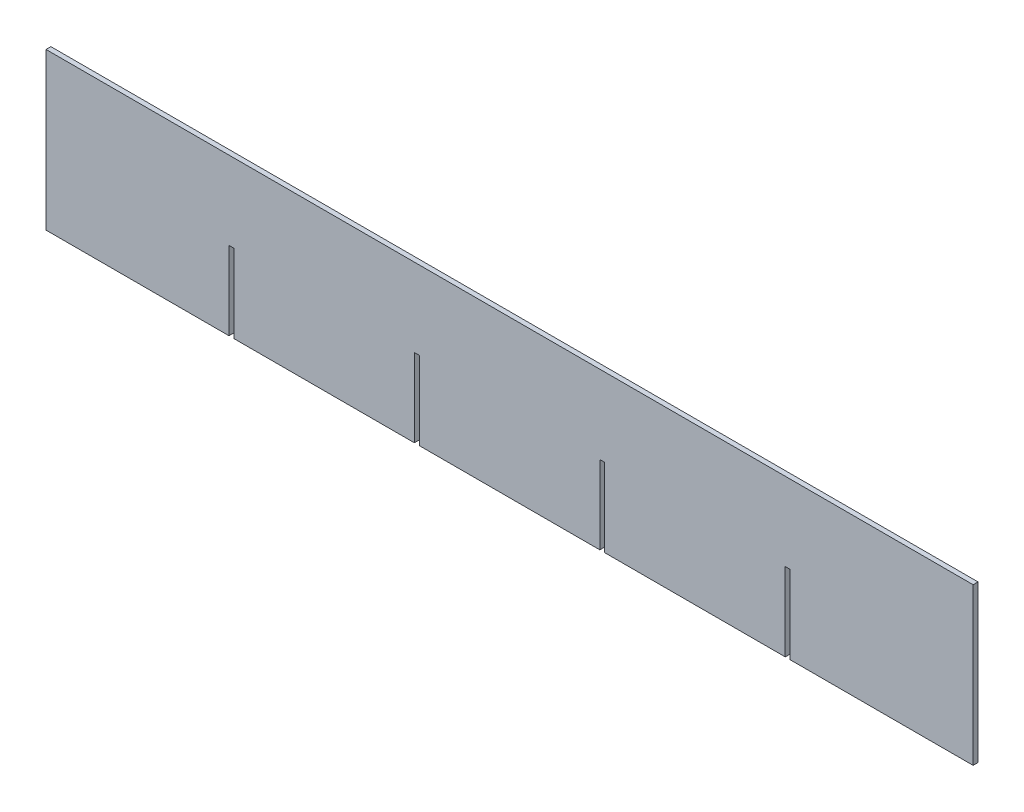
ISO-10303-21;
HEADER;
FILE_DESCRIPTION(('STEP AP214'),'2;1');
FILE_NAME('part.step','',(''),(''),'','','');
FILE_SCHEMA(('AUTOMOTIVE_DESIGN { 1 0 10303 214 1 1 1 1 }'));
ENDSEC;
DATA;
#1=APPLICATION_CONTEXT('core data for automotive mechanical design processes');
#2=APPLICATION_PROTOCOL_DEFINITION('international standard','automotive_design',2000,#1);
#3=PRODUCT_CONTEXT('',#1,'mechanical');
#4=PRODUCT('Part','Part','',(#3));
#5=PRODUCT_RELATED_PRODUCT_CATEGORY('part','',(#4));
#6=PRODUCT_DEFINITION_FORMATION('','',#4);
#7=PRODUCT_DEFINITION_CONTEXT('part definition',#1,'design');
#8=PRODUCT_DEFINITION('design','',#6,#7);
#9=PRODUCT_DEFINITION_SHAPE('','',#8);
#10=(LENGTH_UNIT() NAMED_UNIT(*) SI_UNIT(.MILLI.,.METRE.));
#11=(NAMED_UNIT(*) PLANE_ANGLE_UNIT() SI_UNIT($,.RADIAN.));
#12=(NAMED_UNIT(*) SI_UNIT($,.STERADIAN.) SOLID_ANGLE_UNIT());
#13=UNCERTAINTY_MEASURE_WITH_UNIT(LENGTH_MEASURE(1.E-05),#10,'distance_accuracy_value','');
#14=(GEOMETRIC_REPRESENTATION_CONTEXT(3) GLOBAL_UNCERTAINTY_ASSIGNED_CONTEXT((#13)) GLOBAL_UNIT_ASSIGNED_CONTEXT((#10,
#11,#12)) REPRESENTATION_CONTEXT('',''));
#15=CARTESIAN_POINT('',(0.,0.,0.));
#16=DIRECTION('',(0.,0.,1.));
#17=DIRECTION('',(1.,0.,0.));
#18=AXIS2_PLACEMENT_3D('',#15,#16,#17);
#19=CARTESIAN_POINT('',(237.,40.,1.25));
#20=DIRECTION('',(-1.,0.,0.));
#21=DIRECTION('',(0.,0.,1.));
#22=AXIS2_PLACEMENT_3D('',#19,#20,#21);
#23=PLANE('',#22);
#24=DIRECTION('',(0.,1.,0.));
#25=VECTOR('',#24,1.);
#26=CARTESIAN_POINT('',(237.,40.,-1.25));
#27=LINE('',#26,#25);
#28=CARTESIAN_POINT('',(237.,-40.,-1.25));
#29=VERTEX_POINT('',#28);
#30=CARTESIAN_POINT('',(237.,40.,-1.25));
#31=VERTEX_POINT('',#30);
#32=EDGE_CURVE('E207',#29,#31,#27,.T.);
#33=ORIENTED_EDGE('',*,*,#32,.T.);
#34=DIRECTION('',(0.,0.,-1.));
#35=VECTOR('',#34,1.);
#36=CARTESIAN_POINT('',(237.,40.,1.25));
#37=LINE('',#36,#35);
#38=CARTESIAN_POINT('',(237.,40.,1.25));
#39=VERTEX_POINT('',#38);
#40=EDGE_CURVE('E11',#39,#31,#37,.T.);
#41=ORIENTED_EDGE('',*,*,#40,.F.);
#42=DIRECTION('',(0.,1.,0.));
#43=VECTOR('',#42,1.);
#44=CARTESIAN_POINT('',(237.,40.,1.25));
#45=LINE('',#44,#43);
#46=CARTESIAN_POINT('',(237.,-40.,1.25));
#47=VERTEX_POINT('',#46);
#48=EDGE_CURVE('E245',#47,#39,#45,.T.);
#49=ORIENTED_EDGE('',*,*,#48,.F.);
#50=DIRECTION('',(0.,0.,-1.));
#51=VECTOR('',#50,1.);
#52=CARTESIAN_POINT('',(237.,-40.,1.25));
#53=LINE('',#52,#51);
#54=EDGE_CURVE('E203',#47,#29,#53,.T.);
#55=ORIENTED_EDGE('',*,*,#54,.T.);
#56=EDGE_LOOP('',(#33,#41,#49,#55));
#57=FACE_BOUND('',#56,.T.);
#58=ADVANCED_FACE('F39',(#57),#23,.F.);
#59=CARTESIAN_POINT('',(-237.,40.,1.25));
#60=DIRECTION('',(0.,-1.,0.));
#61=DIRECTION('',(0.,0.,-1.));
#62=AXIS2_PLACEMENT_3D('',#59,#60,#61);
#63=PLANE('',#62);
#64=DIRECTION('',(-1.,0.,0.));
#65=VECTOR('',#64,1.);
#66=CARTESIAN_POINT('',(-237.,40.,-1.25));
#67=LINE('',#66,#65);
#68=CARTESIAN_POINT('',(-237.,40.,-1.25));
#69=VERTEX_POINT('',#68);
#70=EDGE_CURVE('E210',#31,#69,#67,.T.);
#71=ORIENTED_EDGE('',*,*,#70,.T.);
#72=DIRECTION('',(0.,0.,-1.));
#73=VECTOR('',#72,1.);
#74=CARTESIAN_POINT('',(-237.,40.,1.25));
#75=LINE('',#74,#73);
#76=CARTESIAN_POINT('',(-237.,40.,1.25));
#77=VERTEX_POINT('',#76);
#78=EDGE_CURVE('E47',#77,#69,#75,.T.);
#79=ORIENTED_EDGE('',*,*,#78,.F.);
#80=DIRECTION('',(-1.,0.,0.));
#81=VECTOR('',#80,1.);
#82=CARTESIAN_POINT('',(-237.,40.,1.25));
#83=LINE('',#82,#81);
#84=EDGE_CURVE('E134',#39,#77,#83,.T.);
#85=ORIENTED_EDGE('',*,*,#84,.F.);
#86=ORIENTED_EDGE('',*,*,#40,.T.);
#87=EDGE_LOOP('',(#71,#79,#85,#86));
#88=FACE_BOUND('',#87,.T.);
#89=ADVANCED_FACE('F363',(#88),#63,.F.);
#90=CARTESIAN_POINT('',(-237.,-40.,1.25));
#91=DIRECTION('',(1.,0.,0.));
#92=DIRECTION('',(0.,0.,-1.));
#93=AXIS2_PLACEMENT_3D('',#90,#91,#92);
#94=PLANE('',#93);
#95=DIRECTION('',(0.,-1.,0.));
#96=VECTOR('',#95,1.);
#97=CARTESIAN_POINT('',(-237.,-40.,-1.25));
#98=LINE('',#97,#96);
#99=CARTESIAN_POINT('',(-237.,-40.,-1.25));
#100=VERTEX_POINT('',#99);
#101=EDGE_CURVE('E212',#69,#100,#98,.T.);
#102=ORIENTED_EDGE('',*,*,#101,.T.);
#103=DIRECTION('',(0.,0.,-1.));
#104=VECTOR('',#103,1.);
#105=CARTESIAN_POINT('',(-237.,-40.,1.25));
#106=LINE('',#105,#104);
#107=CARTESIAN_POINT('',(-237.,-40.,1.25));
#108=VERTEX_POINT('',#107);
#109=EDGE_CURVE('E288',#108,#100,#106,.T.);
#110=ORIENTED_EDGE('',*,*,#109,.F.);
#111=DIRECTION('',(0.,-1.,0.));
#112=VECTOR('',#111,1.);
#113=CARTESIAN_POINT('',(-237.,-40.,1.25));
#114=LINE('',#113,#112);
#115=EDGE_CURVE('E296',#77,#108,#114,.T.);
#116=ORIENTED_EDGE('',*,*,#115,.F.);
#117=ORIENTED_EDGE('',*,*,#78,.T.);
#118=EDGE_LOOP('',(#102,#110,#116,#117));
#119=FACE_BOUND('',#118,.T.);
#120=ADVANCED_FACE('F294',(#119),#94,.F.);
#121=CARTESIAN_POINT('',(-143.45,-40.,1.25));
#122=DIRECTION('',(0.,1.,0.));
#123=DIRECTION('',(0.,0.,1.));
#124=AXIS2_PLACEMENT_3D('',#121,#122,#123);
#125=PLANE('',#124);
#126=DIRECTION('',(1.,0.,0.));
#127=VECTOR('',#126,1.);
#128=CARTESIAN_POINT('',(-143.45,-40.,-1.25));
#129=LINE('',#128,#127);
#130=CARTESIAN_POINT('',(-143.45,-40.,-1.25));
#131=VERTEX_POINT('',#130);
#132=EDGE_CURVE('E214',#100,#131,#129,.T.);
#133=ORIENTED_EDGE('',*,*,#132,.T.);
#134=DIRECTION('',(0.,0.,-1.));
#135=VECTOR('',#134,1.);
#136=CARTESIAN_POINT('',(-143.45,-40.,1.25));
#137=LINE('',#136,#135);
#138=CARTESIAN_POINT('',(-143.45,-40.,1.25));
#139=VERTEX_POINT('',#138);
#140=EDGE_CURVE('E285',#139,#131,#137,.T.);
#141=ORIENTED_EDGE('',*,*,#140,.F.);
#142=DIRECTION('',(1.,0.,0.));
#143=VECTOR('',#142,1.);
#144=CARTESIAN_POINT('',(-143.45,-40.,1.25));
#145=LINE('',#144,#143);
#146=EDGE_CURVE('E314',#108,#139,#145,.T.);
#147=ORIENTED_EDGE('',*,*,#146,.F.);
#148=ORIENTED_EDGE('',*,*,#109,.T.);
#149=EDGE_LOOP('',(#133,#141,#147,#148));
#150=FACE_BOUND('',#149,.T.);
#151=ADVANCED_FACE('F305',(#150),#125,.F.);
#152=CARTESIAN_POINT('',(-143.45,-40.,1.25));
#153=DIRECTION('',(-1.,0.,0.));
#154=DIRECTION('',(0.,0.,1.));
#155=AXIS2_PLACEMENT_3D('',#152,#153,#154);
#156=PLANE('',#155);
#157=DIRECTION('',(0.,1.,0.));
#158=VECTOR('',#157,1.);
#159=CARTESIAN_POINT('',(-143.45,-40.,-1.25));
#160=LINE('',#159,#158);
#161=CARTESIAN_POINT('',(-143.45,0.,-1.25));
#162=VERTEX_POINT('',#161);
#163=EDGE_CURVE('E216',#131,#162,#160,.T.);
#164=ORIENTED_EDGE('',*,*,#163,.T.);
#165=DIRECTION('',(0.,0.,-1.));
#166=VECTOR('',#165,1.);
#167=CARTESIAN_POINT('',(-143.45,0.,1.25));
#168=LINE('',#167,#166);
#169=CARTESIAN_POINT('',(-143.45,0.,1.25));
#170=VERTEX_POINT('',#169);
#171=EDGE_CURVE('E282',#170,#162,#168,.T.);
#172=ORIENTED_EDGE('',*,*,#171,.F.);
#173=DIRECTION('',(0.,1.,0.));
#174=VECTOR('',#173,1.);
#175=CARTESIAN_POINT('',(-143.45,-40.,1.25));
#176=LINE('',#175,#174);
#177=EDGE_CURVE('E311',#139,#170,#176,.T.);
#178=ORIENTED_EDGE('',*,*,#177,.F.);
#179=ORIENTED_EDGE('',*,*,#140,.T.);
#180=EDGE_LOOP('',(#164,#172,#178,#179));
#181=FACE_BOUND('',#180,.T.);
#182=ADVANCED_FACE('F309',(#181),#156,.F.);
#183=CARTESIAN_POINT('',(-143.45,0.,1.25));
#184=DIRECTION('',(0.,1.,0.));
#185=DIRECTION('',(0.,0.,1.));
#186=AXIS2_PLACEMENT_3D('',#183,#184,#185);
#187=PLANE('',#186);
#188=DIRECTION('',(1.,0.,0.));
#189=VECTOR('',#188,1.);
#190=CARTESIAN_POINT('',(-143.45,0.,-1.25));
#191=LINE('',#190,#189);
#192=CARTESIAN_POINT('',(-140.95,0.,-1.25));
#193=VERTEX_POINT('',#192);
#194=EDGE_CURVE('E218',#162,#193,#191,.T.);
#195=ORIENTED_EDGE('',*,*,#194,.T.);
#196=DIRECTION('',(0.,0.,-1.));
#197=VECTOR('',#196,1.);
#198=CARTESIAN_POINT('',(-140.95,0.,1.25));
#199=LINE('',#198,#197);
#200=CARTESIAN_POINT('',(-140.95,0.,1.25));
#201=VERTEX_POINT('',#200);
#202=EDGE_CURVE('E279',#201,#193,#199,.T.);
#203=ORIENTED_EDGE('',*,*,#202,.F.);
#204=DIRECTION('',(1.,0.,0.));
#205=VECTOR('',#204,1.);
#206=CARTESIAN_POINT('',(-143.45,0.,1.25));
#207=LINE('',#206,#205);
#208=EDGE_CURVE('E313',#170,#201,#207,.T.);
#209=ORIENTED_EDGE('',*,*,#208,.F.);
#210=ORIENTED_EDGE('',*,*,#171,.T.);
#211=EDGE_LOOP('',(#195,#203,#209,#210));
#212=FACE_BOUND('',#211,.T.);
#213=ADVANCED_FACE('F376',(#212),#187,.F.);
#214=CARTESIAN_POINT('',(-140.95,-40.,1.25));
#215=DIRECTION('',(1.,0.,0.));
#216=DIRECTION('',(0.,0.,-1.));
#217=AXIS2_PLACEMENT_3D('',#214,#215,#216);
#218=PLANE('',#217);
#219=DIRECTION('',(0.,-1.,0.));
#220=VECTOR('',#219,1.);
#221=CARTESIAN_POINT('',(-140.95,-40.,-1.25));
#222=LINE('',#221,#220);
#223=CARTESIAN_POINT('',(-140.95,-40.,-1.25));
#224=VERTEX_POINT('',#223);
#225=EDGE_CURVE('E220',#193,#224,#222,.T.);
#226=ORIENTED_EDGE('',*,*,#225,.T.);
#227=DIRECTION('',(0.,0.,-1.));
#228=VECTOR('',#227,1.);
#229=CARTESIAN_POINT('',(-140.95,-40.,1.25));
#230=LINE('',#229,#228);
#231=CARTESIAN_POINT('',(-140.95,-40.,1.25));
#232=VERTEX_POINT('',#231);
#233=EDGE_CURVE('E276',#232,#224,#230,.T.);
#234=ORIENTED_EDGE('',*,*,#233,.F.);
#235=DIRECTION('',(0.,-1.,0.));
#236=VECTOR('',#235,1.);
#237=CARTESIAN_POINT('',(-140.95,-40.,1.25));
#238=LINE('',#237,#236);
#239=EDGE_CURVE('E316',#201,#232,#238,.T.);
#240=ORIENTED_EDGE('',*,*,#239,.F.);
#241=ORIENTED_EDGE('',*,*,#202,.T.);
#242=EDGE_LOOP('',(#226,#234,#240,#241));
#243=FACE_BOUND('',#242,.T.);
#244=ADVANCED_FACE('F379',(#243),#218,.F.);
#245=CARTESIAN_POINT('',(-48.65,-40.,1.25));
#246=DIRECTION('',(0.,1.,0.));
#247=DIRECTION('',(0.,0.,1.));
#248=AXIS2_PLACEMENT_3D('',#245,#246,#247);
#249=PLANE('',#248);
#250=DIRECTION('',(1.,0.,0.));
#251=VECTOR('',#250,1.);
#252=CARTESIAN_POINT('',(-48.65,-40.,-1.25));
#253=LINE('',#252,#251);
#254=CARTESIAN_POINT('',(-48.65,-40.,-1.25));
#255=VERTEX_POINT('',#254);
#256=EDGE_CURVE('E222',#224,#255,#253,.T.);
#257=ORIENTED_EDGE('',*,*,#256,.T.);
#258=DIRECTION('',(0.,0.,-1.));
#259=VECTOR('',#258,1.);
#260=CARTESIAN_POINT('',(-48.65,-40.,1.25));
#261=LINE('',#260,#259);
#262=CARTESIAN_POINT('',(-48.65,-40.,1.25));
#263=VERTEX_POINT('',#262);
#264=EDGE_CURVE('E273',#263,#255,#261,.T.);
#265=ORIENTED_EDGE('',*,*,#264,.F.);
#266=DIRECTION('',(1.,0.,0.));
#267=VECTOR('',#266,1.);
#268=CARTESIAN_POINT('',(-48.65,-40.,1.25));
#269=LINE('',#268,#267);
#270=EDGE_CURVE('E322',#232,#263,#269,.T.);
#271=ORIENTED_EDGE('',*,*,#270,.F.);
#272=ORIENTED_EDGE('',*,*,#233,.T.);
#273=EDGE_LOOP('',(#257,#265,#271,#272));
#274=FACE_BOUND('',#273,.T.);
#275=ADVANCED_FACE('F383',(#274),#249,.F.);
#276=CARTESIAN_POINT('',(-48.65,-40.,1.25));
#277=DIRECTION('',(-1.,0.,0.));
#278=DIRECTION('',(0.,0.,1.));
#279=AXIS2_PLACEMENT_3D('',#276,#277,#278);
#280=PLANE('',#279);
#281=DIRECTION('',(0.,1.,0.));
#282=VECTOR('',#281,1.);
#283=CARTESIAN_POINT('',(-48.65,-40.,-1.25));
#284=LINE('',#283,#282);
#285=CARTESIAN_POINT('',(-48.65,0.,-1.25));
#286=VERTEX_POINT('',#285);
#287=EDGE_CURVE('E224',#255,#286,#284,.T.);
#288=ORIENTED_EDGE('',*,*,#287,.T.);
#289=DIRECTION('',(0.,0.,-1.));
#290=VECTOR('',#289,1.);
#291=CARTESIAN_POINT('',(-48.65,0.,1.25));
#292=LINE('',#291,#290);
#293=CARTESIAN_POINT('',(-48.65,0.,1.25));
#294=VERTEX_POINT('',#293);
#295=EDGE_CURVE('E270',#294,#286,#292,.T.);
#296=ORIENTED_EDGE('',*,*,#295,.F.);
#297=DIRECTION('',(0.,1.,0.));
#298=VECTOR('',#297,1.);
#299=CARTESIAN_POINT('',(-48.65,-40.,1.25));
#300=LINE('',#299,#298);
#301=EDGE_CURVE('E324',#263,#294,#300,.T.);
#302=ORIENTED_EDGE('',*,*,#301,.F.);
#303=ORIENTED_EDGE('',*,*,#264,.T.);
#304=EDGE_LOOP('',(#288,#296,#302,#303));
#305=FACE_BOUND('',#304,.T.);
#306=ADVANCED_FACE('F387',(#305),#280,.F.);
#307=CARTESIAN_POINT('',(-48.65,0.,1.25));
#308=DIRECTION('',(0.,1.,0.));
#309=DIRECTION('',(0.,0.,1.));
#310=AXIS2_PLACEMENT_3D('',#307,#308,#309);
#311=PLANE('',#310);
#312=DIRECTION('',(1.,0.,0.));
#313=VECTOR('',#312,1.);
#314=CARTESIAN_POINT('',(-48.65,0.,-1.25));
#315=LINE('',#314,#313);
#316=CARTESIAN_POINT('',(-46.15,0.,-1.25));
#317=VERTEX_POINT('',#316);
#318=EDGE_CURVE('E226',#286,#317,#315,.T.);
#319=ORIENTED_EDGE('',*,*,#318,.T.);
#320=DIRECTION('',(0.,0.,-1.));
#321=VECTOR('',#320,1.);
#322=CARTESIAN_POINT('',(-46.15,0.,1.25));
#323=LINE('',#322,#321);
#324=CARTESIAN_POINT('',(-46.15,0.,1.25));
#325=VERTEX_POINT('',#324);
#326=EDGE_CURVE('E267',#325,#317,#323,.T.);
#327=ORIENTED_EDGE('',*,*,#326,.F.);
#328=DIRECTION('',(1.,0.,0.));
#329=VECTOR('',#328,1.);
#330=CARTESIAN_POINT('',(-48.65,0.,1.25));
#331=LINE('',#330,#329);
#332=EDGE_CURVE('E326',#294,#325,#331,.T.);
#333=ORIENTED_EDGE('',*,*,#332,.F.);
#334=ORIENTED_EDGE('',*,*,#295,.T.);
#335=EDGE_LOOP('',(#319,#327,#333,#334));
#336=FACE_BOUND('',#335,.T.);
#337=ADVANCED_FACE('F391',(#336),#311,.F.);
#338=CARTESIAN_POINT('',(-46.15,-40.,1.25));
#339=DIRECTION('',(1.,0.,0.));
#340=DIRECTION('',(0.,0.,-1.));
#341=AXIS2_PLACEMENT_3D('',#338,#339,#340);
#342=PLANE('',#341);
#343=DIRECTION('',(0.,-1.,0.));
#344=VECTOR('',#343,1.);
#345=CARTESIAN_POINT('',(-46.15,-40.,-1.25));
#346=LINE('',#345,#344);
#347=CARTESIAN_POINT('',(-46.15,-40.,-1.25));
#348=VERTEX_POINT('',#347);
#349=EDGE_CURVE('E228',#317,#348,#346,.T.);
#350=ORIENTED_EDGE('',*,*,#349,.T.);
#351=DIRECTION('',(0.,0.,-1.));
#352=VECTOR('',#351,1.);
#353=CARTESIAN_POINT('',(-46.15,-40.,1.25));
#354=LINE('',#353,#352);
#355=CARTESIAN_POINT('',(-46.15,-40.,1.25));
#356=VERTEX_POINT('',#355);
#357=EDGE_CURVE('E264',#356,#348,#354,.T.);
#358=ORIENTED_EDGE('',*,*,#357,.F.);
#359=DIRECTION('',(0.,-1.,0.));
#360=VECTOR('',#359,1.);
#361=CARTESIAN_POINT('',(-46.15,-40.,1.25));
#362=LINE('',#361,#360);
#363=EDGE_CURVE('E328',#325,#356,#362,.T.);
#364=ORIENTED_EDGE('',*,*,#363,.F.);
#365=ORIENTED_EDGE('',*,*,#326,.T.);
#366=EDGE_LOOP('',(#350,#358,#364,#365));
#367=FACE_BOUND('',#366,.T.);
#368=ADVANCED_FACE('F395',(#367),#342,.F.);
#369=CARTESIAN_POINT('',(46.15,-40.,1.25));
#370=DIRECTION('',(0.,1.,0.));
#371=DIRECTION('',(0.,0.,1.));
#372=AXIS2_PLACEMENT_3D('',#369,#370,#371);
#373=PLANE('',#372);
#374=DIRECTION('',(1.,0.,0.));
#375=VECTOR('',#374,1.);
#376=CARTESIAN_POINT('',(46.15,-40.,-1.25));
#377=LINE('',#376,#375);
#378=CARTESIAN_POINT('',(46.15,-40.,-1.25));
#379=VERTEX_POINT('',#378);
#380=EDGE_CURVE('E230',#348,#379,#377,.T.);
#381=ORIENTED_EDGE('',*,*,#380,.T.);
#382=DIRECTION('',(0.,0.,-1.));
#383=VECTOR('',#382,1.);
#384=CARTESIAN_POINT('',(46.15,-40.,1.25));
#385=LINE('',#384,#383);
#386=CARTESIAN_POINT('',(46.15,-40.,1.25));
#387=VERTEX_POINT('',#386);
#388=EDGE_CURVE('E261',#387,#379,#385,.T.);
#389=ORIENTED_EDGE('',*,*,#388,.F.);
#390=DIRECTION('',(1.,0.,0.));
#391=VECTOR('',#390,1.);
#392=CARTESIAN_POINT('',(46.15,-40.,1.25));
#393=LINE('',#392,#391);
#394=EDGE_CURVE('E330',#356,#387,#393,.T.);
#395=ORIENTED_EDGE('',*,*,#394,.F.);
#396=ORIENTED_EDGE('',*,*,#357,.T.);
#397=EDGE_LOOP('',(#381,#389,#395,#396));
#398=FACE_BOUND('',#397,.T.);
#399=ADVANCED_FACE('F399',(#398),#373,.F.);
#400=CARTESIAN_POINT('',(46.15,-40.,1.25));
#401=DIRECTION('',(-1.,0.,0.));
#402=DIRECTION('',(0.,0.,1.));
#403=AXIS2_PLACEMENT_3D('',#400,#401,#402);
#404=PLANE('',#403);
#405=DIRECTION('',(0.,1.,0.));
#406=VECTOR('',#405,1.);
#407=CARTESIAN_POINT('',(46.15,-40.,-1.25));
#408=LINE('',#407,#406);
#409=CARTESIAN_POINT('',(46.15,0.,-1.25));
#410=VERTEX_POINT('',#409);
#411=EDGE_CURVE('E232',#379,#410,#408,.T.);
#412=ORIENTED_EDGE('',*,*,#411,.T.);
#413=DIRECTION('',(0.,0.,-1.));
#414=VECTOR('',#413,1.);
#415=CARTESIAN_POINT('',(46.15,0.,1.25));
#416=LINE('',#415,#414);
#417=CARTESIAN_POINT('',(46.15,0.,1.25));
#418=VERTEX_POINT('',#417);
#419=EDGE_CURVE('E258',#418,#410,#416,.T.);
#420=ORIENTED_EDGE('',*,*,#419,.F.);
#421=DIRECTION('',(0.,1.,0.));
#422=VECTOR('',#421,1.);
#423=CARTESIAN_POINT('',(46.15,-40.,1.25));
#424=LINE('',#423,#422);
#425=EDGE_CURVE('E332',#387,#418,#424,.T.);
#426=ORIENTED_EDGE('',*,*,#425,.F.);
#427=ORIENTED_EDGE('',*,*,#388,.T.);
#428=EDGE_LOOP('',(#412,#420,#426,#427));
#429=FACE_BOUND('',#428,.T.);
#430=ADVANCED_FACE('F403',(#429),#404,.F.);
#431=CARTESIAN_POINT('',(46.15,0.,1.25));
#432=DIRECTION('',(0.,1.,0.));
#433=DIRECTION('',(0.,0.,1.));
#434=AXIS2_PLACEMENT_3D('',#431,#432,#433);
#435=PLANE('',#434);
#436=DIRECTION('',(1.,0.,0.));
#437=VECTOR('',#436,1.);
#438=CARTESIAN_POINT('',(46.15,0.,-1.25));
#439=LINE('',#438,#437);
#440=CARTESIAN_POINT('',(48.65,0.,-1.25));
#441=VERTEX_POINT('',#440);
#442=EDGE_CURVE('E234',#410,#441,#439,.T.);
#443=ORIENTED_EDGE('',*,*,#442,.T.);
#444=DIRECTION('',(0.,0.,-1.));
#445=VECTOR('',#444,1.);
#446=CARTESIAN_POINT('',(48.65,0.,1.25));
#447=LINE('',#446,#445);
#448=CARTESIAN_POINT('',(48.65,0.,1.25));
#449=VERTEX_POINT('',#448);
#450=EDGE_CURVE('E255',#449,#441,#447,.T.);
#451=ORIENTED_EDGE('',*,*,#450,.F.);
#452=DIRECTION('',(1.,0.,0.));
#453=VECTOR('',#452,1.);
#454=CARTESIAN_POINT('',(46.15,0.,1.25));
#455=LINE('',#454,#453);
#456=EDGE_CURVE('E334',#418,#449,#455,.T.);
#457=ORIENTED_EDGE('',*,*,#456,.F.);
#458=ORIENTED_EDGE('',*,*,#419,.T.);
#459=EDGE_LOOP('',(#443,#451,#457,#458));
#460=FACE_BOUND('',#459,.T.);
#461=ADVANCED_FACE('F407',(#460),#435,.F.);
#462=CARTESIAN_POINT('',(48.65,-40.,1.25));
#463=DIRECTION('',(1.,0.,0.));
#464=DIRECTION('',(0.,0.,-1.));
#465=AXIS2_PLACEMENT_3D('',#462,#463,#464);
#466=PLANE('',#465);
#467=DIRECTION('',(0.,-1.,0.));
#468=VECTOR('',#467,1.);
#469=CARTESIAN_POINT('',(48.65,-40.,-1.25));
#470=LINE('',#469,#468);
#471=CARTESIAN_POINT('',(48.65,-40.,-1.25));
#472=VERTEX_POINT('',#471);
#473=EDGE_CURVE('E236',#441,#472,#470,.T.);
#474=ORIENTED_EDGE('',*,*,#473,.T.);
#475=DIRECTION('',(0.,0.,-1.));
#476=VECTOR('',#475,1.);
#477=CARTESIAN_POINT('',(48.65,-40.,1.25));
#478=LINE('',#477,#476);
#479=CARTESIAN_POINT('',(48.65,-40.,1.25));
#480=VERTEX_POINT('',#479);
#481=EDGE_CURVE('E252',#480,#472,#478,.T.);
#482=ORIENTED_EDGE('',*,*,#481,.F.);
#483=DIRECTION('',(0.,-1.,0.));
#484=VECTOR('',#483,1.);
#485=CARTESIAN_POINT('',(48.65,-40.,1.25));
#486=LINE('',#485,#484);
#487=EDGE_CURVE('E336',#449,#480,#486,.T.);
#488=ORIENTED_EDGE('',*,*,#487,.F.);
#489=ORIENTED_EDGE('',*,*,#450,.T.);
#490=EDGE_LOOP('',(#474,#482,#488,#489));
#491=FACE_BOUND('',#490,.T.);
#492=ADVANCED_FACE('F411',(#491),#466,.F.);
#493=CARTESIAN_POINT('',(140.95,-40.,1.25));
#494=DIRECTION('',(0.,1.,0.));
#495=DIRECTION('',(0.,0.,1.));
#496=AXIS2_PLACEMENT_3D('',#493,#494,#495);
#497=PLANE('',#496);
#498=DIRECTION('',(1.,0.,0.));
#499=VECTOR('',#498,1.);
#500=CARTESIAN_POINT('',(140.95,-40.,-1.25));
#501=LINE('',#500,#499);
#502=CARTESIAN_POINT('',(140.95,-40.,-1.25));
#503=VERTEX_POINT('',#502);
#504=EDGE_CURVE('E238',#472,#503,#501,.T.);
#505=ORIENTED_EDGE('',*,*,#504,.T.);
#506=DIRECTION('',(0.,0.,-1.));
#507=VECTOR('',#506,1.);
#508=CARTESIAN_POINT('',(140.95,-40.,1.25));
#509=LINE('',#508,#507);
#510=CARTESIAN_POINT('',(140.95,-40.,1.25));
#511=VERTEX_POINT('',#510);
#512=EDGE_CURVE('E249',#511,#503,#509,.T.);
#513=ORIENTED_EDGE('',*,*,#512,.F.);
#514=DIRECTION('',(1.,0.,0.));
#515=VECTOR('',#514,1.);
#516=CARTESIAN_POINT('',(140.95,-40.,1.25));
#517=LINE('',#516,#515);
#518=EDGE_CURVE('E338',#480,#511,#517,.T.);
#519=ORIENTED_EDGE('',*,*,#518,.F.);
#520=ORIENTED_EDGE('',*,*,#481,.T.);
#521=EDGE_LOOP('',(#505,#513,#519,#520));
#522=FACE_BOUND('',#521,.T.);
#523=ADVANCED_FACE('F344',(#522),#497,.F.);
#524=CARTESIAN_POINT('',(140.95,-40.,1.25));
#525=DIRECTION('',(-1.,0.,0.));
#526=DIRECTION('',(0.,0.,1.));
#527=AXIS2_PLACEMENT_3D('',#524,#525,#526);
#528=PLANE('',#527);
#529=DIRECTION('',(0.,1.,0.));
#530=VECTOR('',#529,1.);
#531=CARTESIAN_POINT('',(140.95,-40.,-1.25));
#532=LINE('',#531,#530);
#533=CARTESIAN_POINT('',(140.95,0.,-1.25));
#534=VERTEX_POINT('',#533);
#535=EDGE_CURVE('E240',#503,#534,#532,.T.);
#536=ORIENTED_EDGE('',*,*,#535,.T.);
#537=DIRECTION('',(0.,0.,-1.));
#538=VECTOR('',#537,1.);
#539=CARTESIAN_POINT('',(140.95,0.,1.25));
#540=LINE('',#539,#538);
#541=CARTESIAN_POINT('',(140.95,0.,1.25));
#542=VERTEX_POINT('',#541);
#543=EDGE_CURVE('E198',#542,#534,#540,.T.);
#544=ORIENTED_EDGE('',*,*,#543,.F.);
#545=DIRECTION('',(0.,1.,0.));
#546=VECTOR('',#545,1.);
#547=CARTESIAN_POINT('',(140.95,-40.,1.25));
#548=LINE('',#547,#546);
#549=EDGE_CURVE('E189',#511,#542,#548,.T.);
#550=ORIENTED_EDGE('',*,*,#549,.F.);
#551=ORIENTED_EDGE('',*,*,#512,.T.);
#552=EDGE_LOOP('',(#536,#544,#550,#551));
#553=FACE_BOUND('',#552,.T.);
#554=ADVANCED_FACE('F348',(#553),#528,.F.);
#555=CARTESIAN_POINT('',(140.95,0.,1.25));
#556=DIRECTION('',(0.,1.,0.));
#557=DIRECTION('',(0.,0.,1.));
#558=AXIS2_PLACEMENT_3D('',#555,#556,#557);
#559=PLANE('',#558);
#560=DIRECTION('',(1.,0.,0.));
#561=VECTOR('',#560,1.);
#562=CARTESIAN_POINT('',(140.95,0.,-1.25));
#563=LINE('',#562,#561);
#564=CARTESIAN_POINT('',(143.45,0.,-1.25));
#565=VERTEX_POINT('',#564);
#566=EDGE_CURVE('E197',#534,#565,#563,.T.);
#567=ORIENTED_EDGE('',*,*,#566,.T.);
#568=DIRECTION('',(0.,0.,-1.));
#569=VECTOR('',#568,1.);
#570=CARTESIAN_POINT('',(143.45,0.,1.25));
#571=LINE('',#570,#569);
#572=CARTESIAN_POINT('',(143.45,0.,1.25));
#573=VERTEX_POINT('',#572);
#574=EDGE_CURVE('E194',#573,#565,#571,.T.);
#575=ORIENTED_EDGE('',*,*,#574,.F.);
#576=DIRECTION('',(1.,0.,0.));
#577=VECTOR('',#576,1.);
#578=CARTESIAN_POINT('',(140.95,0.,1.25));
#579=LINE('',#578,#577);
#580=EDGE_CURVE('E183',#542,#573,#579,.T.);
#581=ORIENTED_EDGE('',*,*,#580,.F.);
#582=ORIENTED_EDGE('',*,*,#543,.T.);
#583=EDGE_LOOP('',(#567,#575,#581,#582));
#584=FACE_BOUND('',#583,.T.);
#585=ADVANCED_FACE('F195',(#584),#559,.F.);
#586=CARTESIAN_POINT('',(143.45,-40.,1.25));
#587=DIRECTION('',(1.,0.,0.));
#588=DIRECTION('',(0.,0.,-1.));
#589=AXIS2_PLACEMENT_3D('',#586,#587,#588);
#590=PLANE('',#589);
#591=DIRECTION('',(0.,-1.,0.));
#592=VECTOR('',#591,1.);
#593=CARTESIAN_POINT('',(143.45,-40.,-1.25));
#594=LINE('',#593,#592);
#595=CARTESIAN_POINT('',(143.45,-40.,-1.25));
#596=VERTEX_POINT('',#595);
#597=EDGE_CURVE('E120',#565,#596,#594,.T.);
#598=ORIENTED_EDGE('',*,*,#597,.T.);
#599=DIRECTION('',(0.,0.,-1.));
#600=VECTOR('',#599,1.);
#601=CARTESIAN_POINT('',(143.45,-40.,1.25));
#602=LINE('',#601,#600);
#603=CARTESIAN_POINT('',(143.45,-40.,1.25));
#604=VERTEX_POINT('',#603);
#605=EDGE_CURVE('E199',#604,#596,#602,.T.);
#606=ORIENTED_EDGE('',*,*,#605,.F.);
#607=DIRECTION('',(0.,-1.,0.));
#608=VECTOR('',#607,1.);
#609=CARTESIAN_POINT('',(143.45,-40.,1.25));
#610=LINE('',#609,#608);
#611=EDGE_CURVE('E187',#573,#604,#610,.T.);
#612=ORIENTED_EDGE('',*,*,#611,.F.);
#613=ORIENTED_EDGE('',*,*,#574,.T.);
#614=EDGE_LOOP('',(#598,#606,#612,#613));
#615=FACE_BOUND('',#614,.T.);
#616=ADVANCED_FACE('F201',(#615),#590,.F.);
#617=CARTESIAN_POINT('',(237.,-40.,1.25));
#618=DIRECTION('',(0.,1.,0.));
#619=DIRECTION('',(0.,0.,1.));
#620=AXIS2_PLACEMENT_3D('',#617,#618,#619);
#621=PLANE('',#620);
#622=DIRECTION('',(1.,0.,0.));
#623=VECTOR('',#622,1.);
#624=CARTESIAN_POINT('',(237.,-40.,-1.25));
#625=LINE('',#624,#623);
#626=EDGE_CURVE('E126',#596,#29,#625,.T.);
#627=ORIENTED_EDGE('',*,*,#626,.T.);
#628=ORIENTED_EDGE('',*,*,#54,.F.);
#629=DIRECTION('',(1.,0.,0.));
#630=VECTOR('',#629,1.);
#631=CARTESIAN_POINT('',(237.,-40.,1.25));
#632=LINE('',#631,#630);
#633=EDGE_CURVE('E55',#604,#47,#632,.T.);
#634=ORIENTED_EDGE('',*,*,#633,.F.);
#635=ORIENTED_EDGE('',*,*,#605,.T.);
#636=EDGE_LOOP('',(#627,#628,#634,#635));
#637=FACE_BOUND('',#636,.T.);
#638=ADVANCED_FACE('F352',(#637),#621,.F.);
#639=CARTESIAN_POINT('',(0.,0.,1.25));
#640=DIRECTION('',(0.,0.,-1.));
#641=DIRECTION('',(-1.,0.,0.));
#642=AXIS2_PLACEMENT_3D('',#639,#640,#641);
#643=PLANE('',#642);
#644=ORIENTED_EDGE('',*,*,#48,.T.);
#645=ORIENTED_EDGE('',*,*,#84,.T.);
#646=ORIENTED_EDGE('',*,*,#115,.T.);
#647=ORIENTED_EDGE('',*,*,#146,.T.);
#648=ORIENTED_EDGE('',*,*,#177,.T.);
#649=ORIENTED_EDGE('',*,*,#208,.T.);
#650=ORIENTED_EDGE('',*,*,#239,.T.);
#651=ORIENTED_EDGE('',*,*,#270,.T.);
#652=ORIENTED_EDGE('',*,*,#301,.T.);
#653=ORIENTED_EDGE('',*,*,#332,.T.);
#654=ORIENTED_EDGE('',*,*,#363,.T.);
#655=ORIENTED_EDGE('',*,*,#394,.T.);
#656=ORIENTED_EDGE('',*,*,#425,.T.);
#657=ORIENTED_EDGE('',*,*,#456,.T.);
#658=ORIENTED_EDGE('',*,*,#487,.T.);
#659=ORIENTED_EDGE('',*,*,#518,.T.);
#660=ORIENTED_EDGE('',*,*,#549,.T.);
#661=ORIENTED_EDGE('',*,*,#580,.T.);
#662=ORIENTED_EDGE('',*,*,#611,.T.);
#663=ORIENTED_EDGE('',*,*,#633,.T.);
#664=EDGE_LOOP('',(#644,#645,#646,#647,#648,#649,#650,#651,#652,#653,#654,#655,#656,#657,#658,
#659,#660,#661,#662,#663));
#665=FACE_BOUND('',#664,.T.);
#666=ADVANCED_FACE('F185',(#665),#643,.F.);
#667=CARTESIAN_POINT('',(0.,0.,-1.25));
#668=DIRECTION('',(0.,0.,-1.));
#669=DIRECTION('',(-1.,0.,0.));
#670=AXIS2_PLACEMENT_3D('',#667,#668,#669);
#671=PLANE('',#670);
#672=ORIENTED_EDGE('',*,*,#32,.F.);
#673=ORIENTED_EDGE('',*,*,#626,.F.);
#674=ORIENTED_EDGE('',*,*,#597,.F.);
#675=ORIENTED_EDGE('',*,*,#566,.F.);
#676=ORIENTED_EDGE('',*,*,#535,.F.);
#677=ORIENTED_EDGE('',*,*,#504,.F.);
#678=ORIENTED_EDGE('',*,*,#473,.F.);
#679=ORIENTED_EDGE('',*,*,#442,.F.);
#680=ORIENTED_EDGE('',*,*,#411,.F.);
#681=ORIENTED_EDGE('',*,*,#380,.F.);
#682=ORIENTED_EDGE('',*,*,#349,.F.);
#683=ORIENTED_EDGE('',*,*,#318,.F.);
#684=ORIENTED_EDGE('',*,*,#287,.F.);
#685=ORIENTED_EDGE('',*,*,#256,.F.);
#686=ORIENTED_EDGE('',*,*,#225,.F.);
#687=ORIENTED_EDGE('',*,*,#194,.F.);
#688=ORIENTED_EDGE('',*,*,#163,.F.);
#689=ORIENTED_EDGE('',*,*,#132,.F.);
#690=ORIENTED_EDGE('',*,*,#101,.F.);
#691=ORIENTED_EDGE('',*,*,#70,.F.);
#692=EDGE_LOOP('',(#672,#673,#674,#675,#676,#677,#678,#679,#680,#681,#682,#683,#684,#685,#686,
#687,#688,#689,#690,#691));
#693=FACE_BOUND('',#692,.T.);
#694=ADVANCED_FACE('F300',(#693),#671,.T.);
#695=CLOSED_SHELL('',(#58,#89,#120,#151,#182,#213,#244,#275,#306,#337,#368,#399,#430,#461,#492,
#523,#554,#585,#616,#638,#666,#694));
#696=MANIFOLD_SOLID_BREP('B2',#695);
#697=ADVANCED_BREP_SHAPE_REPRESENTATION('',(#18,#696),#14);
#698=SHAPE_DEFINITION_REPRESENTATION(#9,#697);
ENDSEC;
END-ISO-10303-21;
